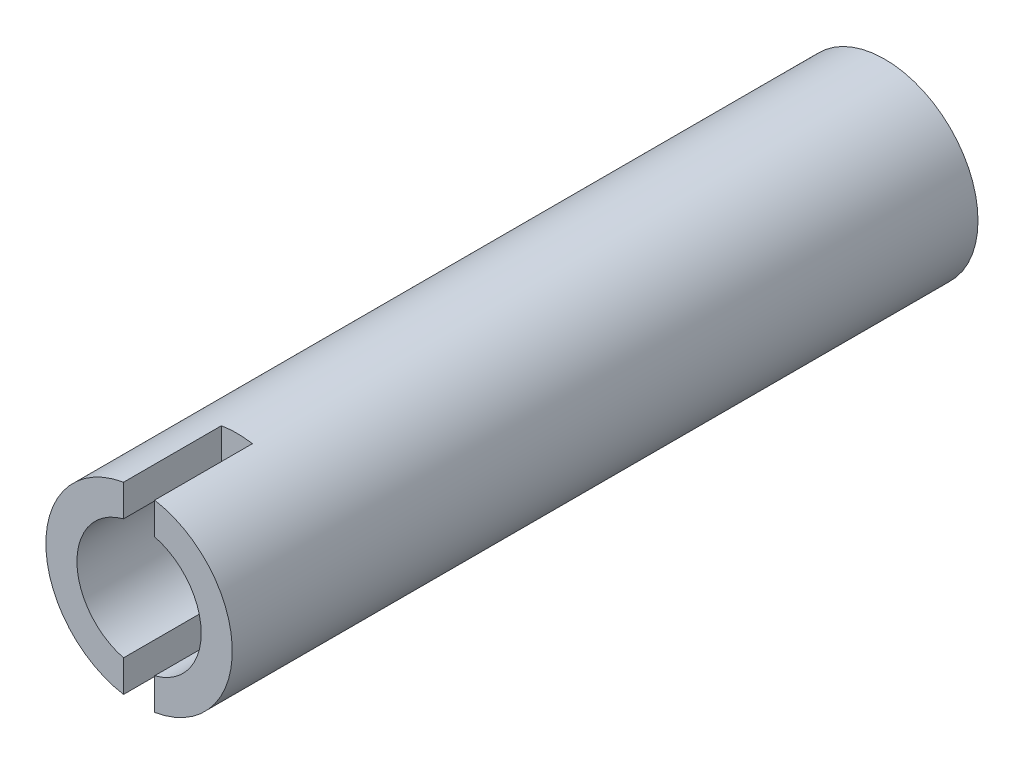
ISO-10303-21;
HEADER;
FILE_DESCRIPTION(('STEP AP214'),'2;1');
FILE_NAME('part.step','',(''),(''),'','','');
FILE_SCHEMA(('AUTOMOTIVE_DESIGN { 1 0 10303 214 1 1 1 1 }'));
ENDSEC;
DATA;
#1=APPLICATION_CONTEXT('core data for automotive mechanical design processes');
#2=APPLICATION_PROTOCOL_DEFINITION('international standard','automotive_design',2000,#1);
#3=PRODUCT_CONTEXT('',#1,'mechanical');
#4=PRODUCT('Part','Part','',(#3));
#5=PRODUCT_RELATED_PRODUCT_CATEGORY('part','',(#4));
#6=PRODUCT_DEFINITION_FORMATION('','',#4);
#7=PRODUCT_DEFINITION_CONTEXT('part definition',#1,'design');
#8=PRODUCT_DEFINITION('design','',#6,#7);
#9=PRODUCT_DEFINITION_SHAPE('','',#8);
#10=(LENGTH_UNIT() NAMED_UNIT(*) SI_UNIT(.MILLI.,.METRE.));
#11=(NAMED_UNIT(*) PLANE_ANGLE_UNIT() SI_UNIT($,.RADIAN.));
#12=(NAMED_UNIT(*) SI_UNIT($,.STERADIAN.) SOLID_ANGLE_UNIT());
#13=UNCERTAINTY_MEASURE_WITH_UNIT(LENGTH_MEASURE(1.E-05),#10,'distance_accuracy_value','');
#14=(GEOMETRIC_REPRESENTATION_CONTEXT(3) GLOBAL_UNCERTAINTY_ASSIGNED_CONTEXT((#13)) GLOBAL_UNIT_ASSIGNED_CONTEXT((#10,
#11,#12)) REPRESENTATION_CONTEXT('',''));
#15=CARTESIAN_POINT('',(0.,0.,0.));
#16=DIRECTION('',(0.,0.,1.));
#17=DIRECTION('',(1.,0.,0.));
#18=AXIS2_PLACEMENT_3D('',#15,#16,#17);
#19=CARTESIAN_POINT('',(0.,0.,76.2));
#20=DIRECTION('',(0.,0.,1.));
#21=DIRECTION('',(1.,0.,0.));
#22=AXIS2_PLACEMENT_3D('',#19,#20,#21);
#23=PLANE('',#22);
#24=DIRECTION('',(0.,1.,0.));
#25=VECTOR('',#24,1.);
#26=CARTESIAN_POINT('',(1.5875,12.589531725546,76.2));
#27=LINE('',#26,#25);
#28=CARTESIAN_POINT('',(1.5875,-9.39177665567064,76.2));
#29=VERTEX_POINT('',#28);
#30=CARTESIAN_POINT('',(1.5875,-6.14836106210427,76.2));
#31=VERTEX_POINT('',#30);
#32=EDGE_CURVE('E100',#29,#31,#27,.T.);
#33=ORIENTED_EDGE('',*,*,#32,.F.);
#34=CARTESIAN_POINT('',(0.,0.,76.2));
#35=DIRECTION('',(0.,0.,1.));
#36=DIRECTION('',(1.,0.,0.));
#37=AXIS2_PLACEMENT_3D('',#34,#35,#36);
#38=CIRCLE('',#37,9.525);
#39=CARTESIAN_POINT('',(1.5875,9.39177665567064,76.2));
#40=VERTEX_POINT('',#39);
#41=EDGE_CURVE('E112',#29,#40,#38,.T.);
#42=ORIENTED_EDGE('',*,*,#41,.T.);
#43=CARTESIAN_POINT('',(1.5875,6.14836106210427,76.2));
#44=VERTEX_POINT('',#43);
#45=EDGE_CURVE('E116',#44,#40,#27,.T.);
#46=ORIENTED_EDGE('',*,*,#45,.F.);
#47=CARTESIAN_POINT('',(0.,0.,76.2));
#48=DIRECTION('',(0.,0.,1.));
#49=DIRECTION('',(1.,0.,0.));
#50=AXIS2_PLACEMENT_3D('',#47,#48,#49);
#51=CIRCLE('',#50,6.35);
#52=EDGE_CURVE('E114',#31,#44,#51,.T.);
#53=ORIENTED_EDGE('',*,*,#52,.F.);
#54=EDGE_LOOP('',(#33,#42,#46,#53));
#55=FACE_BOUND('',#54,.T.);
#56=ADVANCED_FACE('F34',(#55),#23,.T.);
#57=DIRECTION('',(0.,-1.,0.));
#58=VECTOR('',#57,1.);
#59=CARTESIAN_POINT('',(-1.5875,12.589531725546,76.2));
#60=LINE('',#59,#58);
#61=CARTESIAN_POINT('',(-1.5875,9.39177665567064,76.2));
#62=VERTEX_POINT('',#61);
#63=CARTESIAN_POINT('',(-1.5875,6.14836106210427,76.2));
#64=VERTEX_POINT('',#63);
#65=EDGE_CURVE('E153',#62,#64,#60,.T.);
#66=ORIENTED_EDGE('',*,*,#65,.F.);
#67=CARTESIAN_POINT('',(-1.5875,-9.39177665567064,76.2));
#68=VERTEX_POINT('',#67);
#69=EDGE_CURVE('E121',#62,#68,#38,.T.);
#70=ORIENTED_EDGE('',*,*,#69,.T.);
#71=CARTESIAN_POINT('',(-1.5875,-6.14836106210427,76.2));
#72=VERTEX_POINT('',#71);
#73=EDGE_CURVE('E115',#72,#68,#60,.T.);
#74=ORIENTED_EDGE('',*,*,#73,.F.);
#75=EDGE_CURVE('E127',#64,#72,#51,.T.);
#76=ORIENTED_EDGE('',*,*,#75,.F.);
#77=EDGE_LOOP('',(#66,#70,#74,#76));
#78=FACE_BOUND('',#77,.T.);
#79=ADVANCED_FACE('F185',(#78),#23,.T.);
#80=CARTESIAN_POINT('',(0.,0.,0.));
#81=DIRECTION('',(0.,0.,1.));
#82=DIRECTION('',(1.,0.,0.));
#83=AXIS2_PLACEMENT_3D('',#80,#81,#82);
#84=PLANE('',#83);
#85=CARTESIAN_POINT('',(0.,0.,0.));
#86=DIRECTION('',(0.,0.,1.));
#87=DIRECTION('',(1.,0.,0.));
#88=AXIS2_PLACEMENT_3D('',#85,#86,#87);
#89=CIRCLE('',#88,9.525);
#90=CARTESIAN_POINT('',(9.525,0.,0.));
#91=VERTEX_POINT('',#90);
#92=EDGE_CURVE('E122',#91,#91,#89,.T.);
#93=ORIENTED_EDGE('',*,*,#92,.F.);
#94=EDGE_LOOP('',(#93));
#95=FACE_BOUND('',#94,.T.);
#96=CARTESIAN_POINT('',(0.,0.,0.));
#97=DIRECTION('',(0.,0.,1.));
#98=DIRECTION('',(1.,0.,0.));
#99=AXIS2_PLACEMENT_3D('',#96,#97,#98);
#100=CIRCLE('',#99,6.35);
#101=CARTESIAN_POINT('',(6.35,0.,0.));
#102=VERTEX_POINT('',#101);
#103=EDGE_CURVE('E105',#102,#102,#100,.T.);
#104=ORIENTED_EDGE('',*,*,#103,.T.);
#105=EDGE_LOOP('',(#104));
#106=FACE_BOUND('',#105,.T.);
#107=ADVANCED_FACE('F172',(#95,#106),#84,.F.);
#108=CARTESIAN_POINT('',(0.,0.,76.2));
#109=DIRECTION('',(0.,0.,-1.));
#110=DIRECTION('',(-1.,0.,0.));
#111=AXIS2_PLACEMENT_3D('',#108,#109,#110);
#112=CYLINDRICAL_SURFACE('',#111,9.525);
#113=CARTESIAN_POINT('',(0.,0.,66.2));
#114=DIRECTION('',(0.,0.,1.));
#115=DIRECTION('',(1.,0.,0.));
#116=AXIS2_PLACEMENT_3D('',#113,#114,#115);
#117=CIRCLE('',#116,9.525);
#118=CARTESIAN_POINT('',(1.5875,9.39177665567064,66.2));
#119=VERTEX_POINT('',#118);
#120=CARTESIAN_POINT('',(-1.5875,9.39177665567064,66.2));
#121=VERTEX_POINT('',#120);
#122=EDGE_CURVE('E162',#119,#121,#117,.T.);
#123=ORIENTED_EDGE('',*,*,#122,.F.);
#124=DIRECTION('',(0.,0.,-1.));
#125=VECTOR('',#124,1.);
#126=CARTESIAN_POINT('',(1.5875,9.39177665567064,76.2));
#127=LINE('',#126,#125);
#128=EDGE_CURVE('E106',#119,#40,#127,.F.);
#129=ORIENTED_EDGE('',*,*,#128,.T.);
#130=ORIENTED_EDGE('',*,*,#41,.F.);
#131=DIRECTION('',(0.,0.,-1.));
#132=VECTOR('',#131,1.);
#133=CARTESIAN_POINT('',(1.5875,-9.39177665567064,76.2));
#134=LINE('',#133,#132);
#135=CARTESIAN_POINT('',(1.5875,-9.39177665567064,66.2));
#136=VERTEX_POINT('',#135);
#137=EDGE_CURVE('E97',#29,#136,#134,.T.);
#138=ORIENTED_EDGE('',*,*,#137,.T.);
#139=CARTESIAN_POINT('',(-1.5875,-9.39177665567064,66.2));
#140=VERTEX_POINT('',#139);
#141=EDGE_CURVE('E160',#140,#136,#117,.T.);
#142=ORIENTED_EDGE('',*,*,#141,.F.);
#143=DIRECTION('',(0.,0.,-1.));
#144=VECTOR('',#143,1.);
#145=CARTESIAN_POINT('',(-1.5875,-9.39177665567064,76.2));
#146=LINE('',#145,#144);
#147=EDGE_CURVE('E163',#140,#68,#146,.F.);
#148=ORIENTED_EDGE('',*,*,#147,.T.);
#149=ORIENTED_EDGE('',*,*,#69,.F.);
#150=DIRECTION('',(0.,0.,-1.));
#151=VECTOR('',#150,1.);
#152=CARTESIAN_POINT('',(-1.5875,9.39177665567064,76.2));
#153=LINE('',#152,#151);
#154=EDGE_CURVE('E166',#62,#121,#153,.T.);
#155=ORIENTED_EDGE('',*,*,#154,.T.);
#156=EDGE_LOOP('',(#123,#129,#130,#138,#142,#148,#149,#155));
#157=FACE_BOUND('',#156,.T.);
#158=ORIENTED_EDGE('',*,*,#92,.T.);
#159=EDGE_LOOP('',(#158));
#160=FACE_BOUND('',#159,.T.);
#161=ADVANCED_FACE('F36',(#157,#160),#112,.T.);
#162=CARTESIAN_POINT('',(0.,0.,76.2));
#163=DIRECTION('',(0.,0.,-1.));
#164=DIRECTION('',(-1.,0.,0.));
#165=AXIS2_PLACEMENT_3D('',#162,#163,#164);
#166=CYLINDRICAL_SURFACE('',#165,6.35);
#167=DIRECTION('',(0.,0.,-1.));
#168=VECTOR('',#167,1.);
#169=CARTESIAN_POINT('',(1.5875,6.14836106210427,76.2));
#170=LINE('',#169,#168);
#171=CARTESIAN_POINT('',(1.5875,6.14836106210427,66.2));
#172=VERTEX_POINT('',#171);
#173=EDGE_CURVE('E11',#172,#44,#170,.F.);
#174=ORIENTED_EDGE('',*,*,#173,.F.);
#175=CARTESIAN_POINT('',(0.,0.,66.2));
#176=DIRECTION('',(0.,0.,1.));
#177=DIRECTION('',(1.,0.,0.));
#178=AXIS2_PLACEMENT_3D('',#175,#176,#177);
#179=CIRCLE('',#178,6.35);
#180=CARTESIAN_POINT('',(-1.5875,6.14836106210427,66.2));
#181=VERTEX_POINT('',#180);
#182=EDGE_CURVE('E135',#172,#181,#179,.T.);
#183=ORIENTED_EDGE('',*,*,#182,.T.);
#184=DIRECTION('',(0.,0.,-1.));
#185=VECTOR('',#184,1.);
#186=CARTESIAN_POINT('',(-1.5875,6.14836106210427,76.2));
#187=LINE('',#186,#185);
#188=EDGE_CURVE('E42',#64,#181,#187,.T.);
#189=ORIENTED_EDGE('',*,*,#188,.F.);
#190=ORIENTED_EDGE('',*,*,#75,.T.);
#191=DIRECTION('',(0.,0.,-1.));
#192=VECTOR('',#191,1.);
#193=CARTESIAN_POINT('',(-1.5875,-6.14836106210427,76.2));
#194=LINE('',#193,#192);
#195=CARTESIAN_POINT('',(-1.5875,-6.14836106210427,66.2));
#196=VERTEX_POINT('',#195);
#197=EDGE_CURVE('E134',#196,#72,#194,.F.);
#198=ORIENTED_EDGE('',*,*,#197,.F.);
#199=CARTESIAN_POINT('',(1.5875,-6.14836106210427,66.2));
#200=VERTEX_POINT('',#199);
#201=EDGE_CURVE('E125',#196,#200,#179,.T.);
#202=ORIENTED_EDGE('',*,*,#201,.T.);
#203=DIRECTION('',(0.,0.,-1.));
#204=VECTOR('',#203,1.);
#205=CARTESIAN_POINT('',(1.5875,-6.14836106210427,76.2));
#206=LINE('',#205,#204);
#207=EDGE_CURVE('E137',#31,#200,#206,.T.);
#208=ORIENTED_EDGE('',*,*,#207,.F.);
#209=ORIENTED_EDGE('',*,*,#52,.T.);
#210=EDGE_LOOP('',(#174,#183,#189,#190,#198,#202,#208,#209));
#211=FACE_BOUND('',#210,.T.);
#212=ORIENTED_EDGE('',*,*,#103,.F.);
#213=EDGE_LOOP('',(#212));
#214=FACE_BOUND('',#213,.T.);
#215=ADVANCED_FACE('F143',(#211,#214),#166,.F.);
#216=CARTESIAN_POINT('',(0.,0.,66.2));
#217=DIRECTION('',(0.,0.,1.));
#218=DIRECTION('',(1.,0.,0.));
#219=AXIS2_PLACEMENT_3D('',#216,#217,#218);
#220=PLANE('',#219);
#221=ORIENTED_EDGE('',*,*,#141,.T.);
#222=DIRECTION('',(0.,1.,0.));
#223=VECTOR('',#222,1.);
#224=CARTESIAN_POINT('',(1.5875,12.589531725546,66.2));
#225=LINE('',#224,#223);
#226=EDGE_CURVE('E57',#136,#200,#225,.T.);
#227=ORIENTED_EDGE('',*,*,#226,.T.);
#228=ORIENTED_EDGE('',*,*,#201,.F.);
#229=DIRECTION('',(0.,-1.,0.));
#230=VECTOR('',#229,1.);
#231=CARTESIAN_POINT('',(-1.5875,12.589531725546,66.2));
#232=LINE('',#231,#230);
#233=EDGE_CURVE('E155',#196,#140,#232,.T.);
#234=ORIENTED_EDGE('',*,*,#233,.T.);
#235=EDGE_LOOP('',(#221,#227,#228,#234));
#236=FACE_BOUND('',#235,.T.);
#237=ADVANCED_FACE('F174',(#236),#220,.T.);
#238=CARTESIAN_POINT('',(-1.5875,12.589531725546,66.2));
#239=DIRECTION('',(-1.,0.,0.));
#240=DIRECTION('',(0.,-1.,0.));
#241=AXIS2_PLACEMENT_3D('',#238,#239,#240);
#242=PLANE('',#241);
#243=ORIENTED_EDGE('',*,*,#233,.F.);
#244=ORIENTED_EDGE('',*,*,#197,.T.);
#245=ORIENTED_EDGE('',*,*,#73,.T.);
#246=ORIENTED_EDGE('',*,*,#147,.F.);
#247=EDGE_LOOP('',(#243,#244,#245,#246));
#248=FACE_BOUND('',#247,.T.);
#249=ADVANCED_FACE('F180',(#248),#242,.F.);
#250=CARTESIAN_POINT('',(1.5875,12.589531725546,66.2));
#251=DIRECTION('',(1.,0.,0.));
#252=DIRECTION('',(0.,1.,0.));
#253=AXIS2_PLACEMENT_3D('',#250,#251,#252);
#254=PLANE('',#253);
#255=ORIENTED_EDGE('',*,*,#32,.T.);
#256=ORIENTED_EDGE('',*,*,#207,.T.);
#257=ORIENTED_EDGE('',*,*,#226,.F.);
#258=ORIENTED_EDGE('',*,*,#137,.F.);
#259=EDGE_LOOP('',(#255,#256,#257,#258));
#260=FACE_BOUND('',#259,.T.);
#261=ADVANCED_FACE('F99',(#260),#254,.F.);
#262=EDGE_CURVE('E150',#172,#119,#225,.T.);
#263=ORIENTED_EDGE('',*,*,#262,.F.);
#264=ORIENTED_EDGE('',*,*,#173,.T.);
#265=ORIENTED_EDGE('',*,*,#45,.T.);
#266=ORIENTED_EDGE('',*,*,#128,.F.);
#267=EDGE_LOOP('',(#263,#264,#265,#266));
#268=FACE_BOUND('',#267,.T.);
#269=ADVANCED_FACE('F152',(#268),#254,.F.);
#270=ORIENTED_EDGE('',*,*,#65,.T.);
#271=ORIENTED_EDGE('',*,*,#188,.T.);
#272=EDGE_CURVE('E49',#121,#181,#232,.T.);
#273=ORIENTED_EDGE('',*,*,#272,.F.);
#274=ORIENTED_EDGE('',*,*,#154,.F.);
#275=EDGE_LOOP('',(#270,#271,#273,#274));
#276=FACE_BOUND('',#275,.T.);
#277=ADVANCED_FACE('F225',(#276),#242,.F.);
#278=ORIENTED_EDGE('',*,*,#122,.T.);
#279=ORIENTED_EDGE('',*,*,#272,.T.);
#280=ORIENTED_EDGE('',*,*,#182,.F.);
#281=ORIENTED_EDGE('',*,*,#262,.T.);
#282=EDGE_LOOP('',(#278,#279,#280,#281));
#283=FACE_BOUND('',#282,.T.);
#284=ADVANCED_FACE('F149',(#283),#220,.T.);
#285=CLOSED_SHELL('',(#56,#79,#107,#161,#215,#237,#249,#261,#269,#277,#284));
#286=MANIFOLD_SOLID_BREP('B2',#285);
#287=ADVANCED_BREP_SHAPE_REPRESENTATION('',(#18,#286),#14);
#288=SHAPE_DEFINITION_REPRESENTATION(#9,#287);
ENDSEC;
END-ISO-10303-21;
